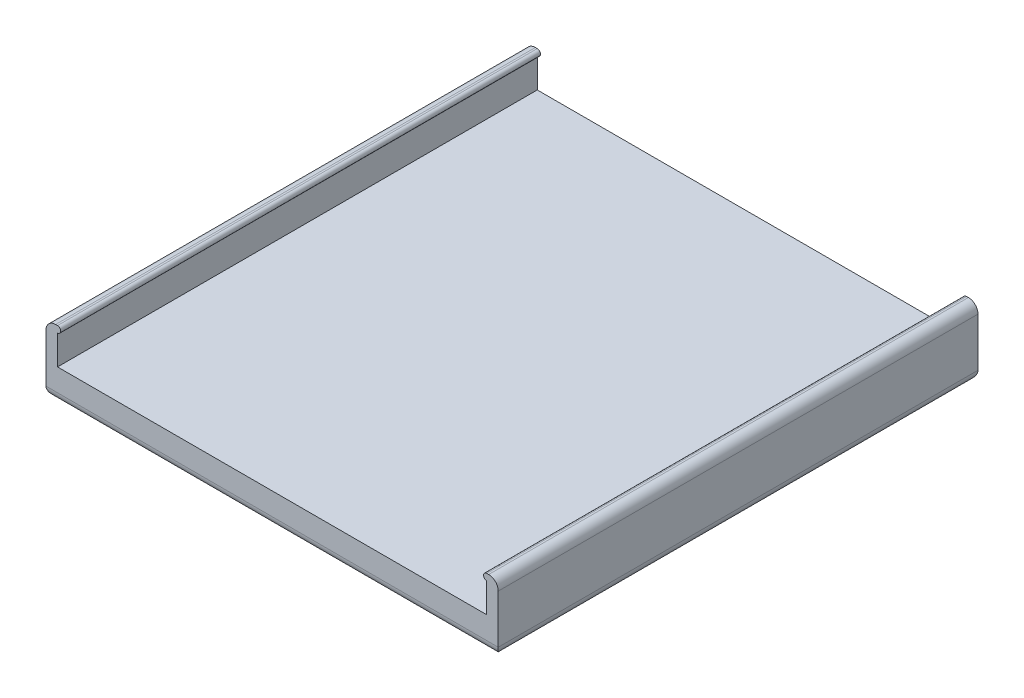
ISO-10303-21;
HEADER;
FILE_DESCRIPTION(('STEP AP214'),'2;1');
FILE_NAME('part.step','',(''),(''),'','','');
FILE_SCHEMA(('AUTOMOTIVE_DESIGN { 1 0 10303 214 1 1 1 1 }'));
ENDSEC;
DATA;
#1=APPLICATION_CONTEXT('core data for automotive mechanical design processes');
#2=APPLICATION_PROTOCOL_DEFINITION('international standard','automotive_design',2000,#1);
#3=PRODUCT_CONTEXT('',#1,'mechanical');
#4=PRODUCT('Part','Part','',(#3));
#5=PRODUCT_RELATED_PRODUCT_CATEGORY('part','',(#4));
#6=PRODUCT_DEFINITION_FORMATION('','',#4);
#7=PRODUCT_DEFINITION_CONTEXT('part definition',#1,'design');
#8=PRODUCT_DEFINITION('design','',#6,#7);
#9=PRODUCT_DEFINITION_SHAPE('','',#8);
#10=(LENGTH_UNIT() NAMED_UNIT(*) SI_UNIT(.MILLI.,.METRE.));
#11=(NAMED_UNIT(*) PLANE_ANGLE_UNIT() SI_UNIT($,.RADIAN.));
#12=(NAMED_UNIT(*) SI_UNIT($,.STERADIAN.) SOLID_ANGLE_UNIT());
#13=UNCERTAINTY_MEASURE_WITH_UNIT(LENGTH_MEASURE(1.E-05),#10,'distance_accuracy_value','');
#14=(GEOMETRIC_REPRESENTATION_CONTEXT(3) GLOBAL_UNCERTAINTY_ASSIGNED_CONTEXT((#13)) GLOBAL_UNIT_ASSIGNED_CONTEXT((#10,
#11,#12)) REPRESENTATION_CONTEXT('',''));
#15=CARTESIAN_POINT('',(0.,0.,0.));
#16=DIRECTION('',(0.,0.,1.));
#17=DIRECTION('',(1.,0.,0.));
#18=AXIS2_PLACEMENT_3D('',#15,#16,#17);
#19=CARTESIAN_POINT('',(36.25,5.,37.5));
#20=DIRECTION('',(0.,0.,-1.));
#21=DIRECTION('',(-1.,0.,0.));
#22=AXIS2_PLACEMENT_3D('',#19,#20,#21);
#23=PLANE('',#22);
#24=DIRECTION('',(0.,1.,0.));
#25=VECTOR('',#24,1.);
#26=CARTESIAN_POINT('',(35.35,10.6,37.5));
#27=LINE('',#26,#25);
#28=CARTESIAN_POINT('',(35.35,1.5,37.5));
#29=VERTEX_POINT('',#28);
#30=CARTESIAN_POINT('',(35.35,9.1,37.5));
#31=VERTEX_POINT('',#30);
#32=EDGE_CURVE('E557',#29,#31,#27,.T.);
#33=ORIENTED_EDGE('',*,*,#32,.T.);
#34=CARTESIAN_POINT('',(33.85,9.1,37.5));
#35=DIRECTION('',(0.,0.,-1.));
#36=DIRECTION('',(-1.,0.,0.));
#37=AXIS2_PLACEMENT_3D('',#34,#35,#36);
#38=CIRCLE('',#37,1.5);
#39=CARTESIAN_POINT('',(33.85,10.6,37.5));
#40=VERTEX_POINT('',#39);
#41=EDGE_CURVE('E252',#31,#40,#38,.F.);
#42=ORIENTED_EDGE('',*,*,#41,.T.);
#43=DIRECTION('',(1.,0.,0.));
#44=VECTOR('',#43,1.);
#45=CARTESIAN_POINT('',(36.25,10.6,37.5));
#46=LINE('',#45,#44);
#47=CARTESIAN_POINT('',(33.55,10.6,37.5));
#48=VERTEX_POINT('',#47);
#49=EDGE_CURVE('E178',#48,#40,#46,.T.);
#50=ORIENTED_EDGE('',*,*,#49,.F.);
#51=CARTESIAN_POINT('',(33.55,10.1,37.5));
#52=DIRECTION('',(0.,0.,1.));
#53=DIRECTION('',(1.,0.,0.));
#54=AXIS2_PLACEMENT_3D('',#51,#52,#53);
#55=CIRCLE('',#54,0.499999999999999);
#56=CARTESIAN_POINT('',(33.55,9.6,37.5));
#57=VERTEX_POINT('',#56);
#58=EDGE_CURVE('E564',#48,#57,#55,.T.);
#59=ORIENTED_EDGE('',*,*,#58,.T.);
#60=DIRECTION('',(0.,-1.,0.));
#61=VECTOR('',#60,1.);
#62=CARTESIAN_POINT('',(33.55,10.6,37.5));
#63=LINE('',#62,#61);
#64=CARTESIAN_POINT('',(33.55,5.,37.5));
#65=VERTEX_POINT('',#64);
#66=EDGE_CURVE('E176',#57,#65,#63,.T.);
#67=ORIENTED_EDGE('',*,*,#66,.T.);
#68=DIRECTION('',(1.,0.,0.));
#69=VECTOR('',#68,1.);
#70=CARTESIAN_POINT('',(36.25,5.,37.5));
#71=LINE('',#70,#69);
#72=CARTESIAN_POINT('',(-33.55,5.,37.5));
#73=VERTEX_POINT('',#72);
#74=EDGE_CURVE('E194',#73,#65,#71,.T.);
#75=ORIENTED_EDGE('',*,*,#74,.F.);
#76=DIRECTION('',(0.,-1.,0.));
#77=VECTOR('',#76,1.);
#78=CARTESIAN_POINT('',(-33.55,10.6,37.5));
#79=LINE('',#78,#77);
#80=CARTESIAN_POINT('',(-33.55,9.6,37.5));
#81=VERTEX_POINT('',#80);
#82=EDGE_CURVE('E166',#81,#73,#79,.T.);
#83=ORIENTED_EDGE('',*,*,#82,.F.);
#84=CARTESIAN_POINT('',(-33.55,10.1,37.5));
#85=DIRECTION('',(0.,0.,1.));
#86=DIRECTION('',(1.,0.,0.));
#87=AXIS2_PLACEMENT_3D('',#84,#85,#86);
#88=CIRCLE('',#87,0.499999999999999);
#89=CARTESIAN_POINT('',(-33.55,10.6,37.5));
#90=VERTEX_POINT('',#89);
#91=EDGE_CURVE('E147',#81,#90,#88,.T.);
#92=ORIENTED_EDGE('',*,*,#91,.T.);
#93=DIRECTION('',(1.,0.,0.));
#94=VECTOR('',#93,1.);
#95=CARTESIAN_POINT('',(-36.25,10.6,37.5));
#96=LINE('',#95,#94);
#97=CARTESIAN_POINT('',(-33.85,10.6,37.5));
#98=VERTEX_POINT('',#97);
#99=EDGE_CURVE('E572',#98,#90,#96,.T.);
#100=ORIENTED_EDGE('',*,*,#99,.F.);
#101=CARTESIAN_POINT('',(-33.85,9.1,37.5));
#102=DIRECTION('',(0.,0.,-1.));
#103=DIRECTION('',(-1.,0.,0.));
#104=AXIS2_PLACEMENT_3D('',#101,#102,#103);
#105=CIRCLE('',#104,1.5);
#106=CARTESIAN_POINT('',(-35.35,9.1,37.5));
#107=VERTEX_POINT('',#106);
#108=EDGE_CURVE('E61',#98,#107,#105,.F.);
#109=ORIENTED_EDGE('',*,*,#108,.T.);
#110=DIRECTION('',(0.,-1.,0.));
#111=VECTOR('',#110,1.);
#112=CARTESIAN_POINT('',(-35.35,0.,37.5));
#113=LINE('',#112,#111);
#114=CARTESIAN_POINT('',(-35.35,1.5,37.5));
#115=VERTEX_POINT('',#114);
#116=EDGE_CURVE('E242',#107,#115,#113,.T.);
#117=ORIENTED_EDGE('',*,*,#116,.T.);
#118=DIRECTION('',(1.,0.,0.));
#119=VECTOR('',#118,1.);
#120=CARTESIAN_POINT('',(36.25,1.5,37.5));
#121=LINE('',#120,#119);
#122=EDGE_CURVE('E223',#115,#29,#121,.T.);
#123=ORIENTED_EDGE('',*,*,#122,.T.);
#124=EDGE_LOOP('',(#33,#42,#50,#59,#67,#75,#83,#92,#100,#109,#117,#123));
#125=FACE_BOUND('',#124,.T.);
#126=ADVANCED_FACE('F39',(#125),#23,.F.);
#127=CARTESIAN_POINT('',(36.25,5.,-37.5));
#128=DIRECTION('',(0.,0.,1.));
#129=DIRECTION('',(1.,0.,0.));
#130=AXIS2_PLACEMENT_3D('',#127,#128,#129);
#131=PLANE('',#130);
#132=DIRECTION('',(-1.,0.,0.));
#133=VECTOR('',#132,1.);
#134=CARTESIAN_POINT('',(36.25,10.6,-37.5));
#135=LINE('',#134,#133);
#136=CARTESIAN_POINT('',(33.85,10.6,-37.5));
#137=VERTEX_POINT('',#136);
#138=CARTESIAN_POINT('',(33.55,10.6,-37.5));
#139=VERTEX_POINT('',#138);
#140=EDGE_CURVE('E182',#137,#139,#135,.T.);
#141=ORIENTED_EDGE('',*,*,#140,.F.);
#142=CARTESIAN_POINT('',(33.85,9.1,-37.5));
#143=DIRECTION('',(0.,0.,1.));
#144=DIRECTION('',(1.,0.,0.));
#145=AXIS2_PLACEMENT_3D('',#142,#143,#144);
#146=CIRCLE('',#145,1.5);
#147=CARTESIAN_POINT('',(35.35,9.1,-37.5));
#148=VERTEX_POINT('',#147);
#149=EDGE_CURVE('E247',#137,#148,#146,.F.);
#150=ORIENTED_EDGE('',*,*,#149,.T.);
#151=DIRECTION('',(0.,1.,0.));
#152=VECTOR('',#151,1.);
#153=CARTESIAN_POINT('',(35.35,10.6,-37.5));
#154=LINE('',#153,#152);
#155=CARTESIAN_POINT('',(35.35,1.5,-37.5));
#156=VERTEX_POINT('',#155);
#157=EDGE_CURVE('E555',#156,#148,#154,.T.);
#158=ORIENTED_EDGE('',*,*,#157,.F.);
#159=DIRECTION('',(-1.,0.,0.));
#160=VECTOR('',#159,1.);
#161=CARTESIAN_POINT('',(36.25,1.5,-37.5));
#162=LINE('',#161,#160);
#163=CARTESIAN_POINT('',(-35.35,1.5,-37.5));
#164=VERTEX_POINT('',#163);
#165=EDGE_CURVE('E211',#156,#164,#162,.T.);
#166=ORIENTED_EDGE('',*,*,#165,.T.);
#167=DIRECTION('',(0.,-1.,0.));
#168=VECTOR('',#167,1.);
#169=CARTESIAN_POINT('',(-35.35,0.,-37.5));
#170=LINE('',#169,#168);
#171=CARTESIAN_POINT('',(-35.35,9.1,-37.5));
#172=VERTEX_POINT('',#171);
#173=EDGE_CURVE('E553',#172,#164,#170,.T.);
#174=ORIENTED_EDGE('',*,*,#173,.F.);
#175=CARTESIAN_POINT('',(-33.85,9.1,-37.5));
#176=DIRECTION('',(0.,0.,1.));
#177=DIRECTION('',(1.,0.,0.));
#178=AXIS2_PLACEMENT_3D('',#175,#176,#177);
#179=CIRCLE('',#178,1.5);
#180=CARTESIAN_POINT('',(-33.85,10.6,-37.5));
#181=VERTEX_POINT('',#180);
#182=EDGE_CURVE('E245',#172,#181,#179,.F.);
#183=ORIENTED_EDGE('',*,*,#182,.T.);
#184=DIRECTION('',(-1.,0.,0.));
#185=VECTOR('',#184,1.);
#186=CARTESIAN_POINT('',(-36.25,10.6,-37.5));
#187=LINE('',#186,#185);
#188=CARTESIAN_POINT('',(-33.55,10.6,-37.5));
#189=VERTEX_POINT('',#188);
#190=EDGE_CURVE('E160',#189,#181,#187,.T.);
#191=ORIENTED_EDGE('',*,*,#190,.F.);
#192=CARTESIAN_POINT('',(-33.55,10.1,-37.5));
#193=DIRECTION('',(0.,0.,1.));
#194=DIRECTION('',(1.,0.,0.));
#195=AXIS2_PLACEMENT_3D('',#192,#193,#194);
#196=CIRCLE('',#195,0.499999999999999);
#197=CARTESIAN_POINT('',(-33.55,9.6,-37.5));
#198=VERTEX_POINT('',#197);
#199=EDGE_CURVE('E144',#189,#198,#196,.F.);
#200=ORIENTED_EDGE('',*,*,#199,.T.);
#201=DIRECTION('',(0.,-1.,0.));
#202=VECTOR('',#201,1.);
#203=CARTESIAN_POINT('',(-33.55,10.6,-37.5));
#204=LINE('',#203,#202);
#205=CARTESIAN_POINT('',(-33.55,5.,-37.5));
#206=VERTEX_POINT('',#205);
#207=EDGE_CURVE('E158',#198,#206,#204,.T.);
#208=ORIENTED_EDGE('',*,*,#207,.T.);
#209=DIRECTION('',(-1.,0.,0.));
#210=VECTOR('',#209,1.);
#211=CARTESIAN_POINT('',(36.25,5.,-37.5));
#212=LINE('',#211,#210);
#213=CARTESIAN_POINT('',(33.55,5.,-37.5));
#214=VERTEX_POINT('',#213);
#215=EDGE_CURVE('E197',#214,#206,#212,.T.);
#216=ORIENTED_EDGE('',*,*,#215,.F.);
#217=DIRECTION('',(0.,-1.,0.));
#218=VECTOR('',#217,1.);
#219=CARTESIAN_POINT('',(33.55,10.6,-37.5));
#220=LINE('',#219,#218);
#221=CARTESIAN_POINT('',(33.55,9.6,-37.5));
#222=VERTEX_POINT('',#221);
#223=EDGE_CURVE('E174',#222,#214,#220,.T.);
#224=ORIENTED_EDGE('',*,*,#223,.F.);
#225=CARTESIAN_POINT('',(33.55,10.1,-37.5));
#226=DIRECTION('',(0.,0.,1.));
#227=DIRECTION('',(1.,0.,0.));
#228=AXIS2_PLACEMENT_3D('',#225,#226,#227);
#229=CIRCLE('',#228,0.499999999999999);
#230=EDGE_CURVE('E559',#222,#139,#229,.F.);
#231=ORIENTED_EDGE('',*,*,#230,.T.);
#232=EDGE_LOOP('',(#141,#150,#158,#166,#174,#183,#191,#200,#208,#216,#224,#231));
#233=FACE_BOUND('',#232,.T.);
#234=ADVANCED_FACE('F156',(#233),#131,.F.);
#235=CARTESIAN_POINT('',(0.,5.,0.));
#236=DIRECTION('',(0.,1.,0.));
#237=DIRECTION('',(0.,0.,1.));
#238=AXIS2_PLACEMENT_3D('',#235,#236,#237);
#239=PLANE('',#238);
#240=DIRECTION('',(0.,0.,-1.));
#241=VECTOR('',#240,1.);
#242=CARTESIAN_POINT('',(-33.55,5.,37.5));
#243=LINE('',#242,#241);
#244=EDGE_CURVE('E165',#73,#206,#243,.T.);
#245=ORIENTED_EDGE('',*,*,#244,.F.);
#246=ORIENTED_EDGE('',*,*,#74,.T.);
#247=DIRECTION('',(0.,0.,1.));
#248=VECTOR('',#247,1.);
#249=CARTESIAN_POINT('',(33.55,5.,37.5));
#250=LINE('',#249,#248);
#251=EDGE_CURVE('E179',#214,#65,#250,.T.);
#252=ORIENTED_EDGE('',*,*,#251,.F.);
#253=ORIENTED_EDGE('',*,*,#215,.T.);
#254=EDGE_LOOP('',(#245,#246,#252,#253));
#255=FACE_BOUND('',#254,.T.);
#256=ADVANCED_FACE('F297',(#255),#239,.T.);
#257=CARTESIAN_POINT('',(0.,0.,0.));
#258=DIRECTION('',(0.,1.,0.));
#259=DIRECTION('',(0.,0.,1.));
#260=AXIS2_PLACEMENT_3D('',#257,#258,#259);
#261=PLANE('',#260);
#262=DIRECTION('',(1.,0.,0.));
#263=VECTOR('',#262,1.);
#264=CARTESIAN_POINT('',(0.,0.,36.));
#265=LINE('',#264,#263);
#266=CARTESIAN_POINT('',(33.85,0.,36.));
#267=VERTEX_POINT('',#266);
#268=CARTESIAN_POINT('',(-33.85,0.,36.));
#269=VERTEX_POINT('',#268);
#270=EDGE_CURVE('E216',#267,#269,#265,.F.);
#271=ORIENTED_EDGE('',*,*,#270,.T.);
#272=DIRECTION('',(0.,0.,-1.));
#273=VECTOR('',#272,1.);
#274=CARTESIAN_POINT('',(-33.85,0.,0.));
#275=LINE('',#274,#273);
#276=CARTESIAN_POINT('',(-33.85,0.,-36.));
#277=VERTEX_POINT('',#276);
#278=EDGE_CURVE('E221',#269,#277,#275,.T.);
#279=ORIENTED_EDGE('',*,*,#278,.T.);
#280=DIRECTION('',(-1.,0.,0.));
#281=VECTOR('',#280,1.);
#282=CARTESIAN_POINT('',(0.,0.,-36.));
#283=LINE('',#282,#281);
#284=CARTESIAN_POINT('',(33.85,0.,-36.));
#285=VERTEX_POINT('',#284);
#286=EDGE_CURVE('E218',#277,#285,#283,.F.);
#287=ORIENTED_EDGE('',*,*,#286,.T.);
#288=DIRECTION('',(0.,0.,-1.));
#289=VECTOR('',#288,1.);
#290=CARTESIAN_POINT('',(33.85,0.,0.));
#291=LINE('',#290,#289);
#292=EDGE_CURVE('E214',#285,#267,#291,.F.);
#293=ORIENTED_EDGE('',*,*,#292,.T.);
#294=EDGE_LOOP('',(#271,#279,#287,#293));
#295=FACE_BOUND('',#294,.T.);
#296=CARTESIAN_POINT('',(0.,0.,0.));
#297=DIRECTION('',(0.,1.,0.));
#298=DIRECTION('',(0.,0.,1.));
#299=AXIS2_PLACEMENT_3D('',#296,#297,#298);
#300=CIRCLE('',#299,29.1);
#301=CARTESIAN_POINT('',(0.,0.,29.1));
#302=VERTEX_POINT('',#301);
#303=EDGE_CURVE('E202',#302,#302,#300,.T.);
#304=ORIENTED_EDGE('',*,*,#303,.T.);
#305=EDGE_LOOP('',(#304));
#306=FACE_BOUND('',#305,.T.);
#307=ADVANCED_FACE('F301',(#295,#306),#261,.F.);
#308=CARTESIAN_POINT('',(0.,-5.,0.));
#309=DIRECTION('',(0.,-1.,0.));
#310=DIRECTION('',(0.,0.,-1.));
#311=AXIS2_PLACEMENT_3D('',#308,#309,#310);
#312=PLANE('',#311);
#313=CARTESIAN_POINT('',(0.,-5.,0.));
#314=DIRECTION('',(0.,-1.,0.));
#315=DIRECTION('',(0.,0.,-1.));
#316=AXIS2_PLACEMENT_3D('',#313,#314,#315);
#317=CIRCLE('',#316,26.1);
#318=CARTESIAN_POINT('',(0.,-5.,-26.1));
#319=VERTEX_POINT('',#318);
#320=EDGE_CURVE('E208',#319,#319,#317,.F.);
#321=ORIENTED_EDGE('',*,*,#320,.T.);
#322=EDGE_LOOP('',(#321));
#323=FACE_BOUND('',#322,.T.);
#324=CARTESIAN_POINT('',(0.,-5.,0.));
#325=DIRECTION('',(0.,-1.,0.));
#326=DIRECTION('',(0.,0.,-1.));
#327=AXIS2_PLACEMENT_3D('',#324,#325,#326);
#328=CIRCLE('',#327,27.1);
#329=CARTESIAN_POINT('',(0.,-5.,-27.1));
#330=VERTEX_POINT('',#329);
#331=EDGE_CURVE('E191',#330,#330,#328,.T.);
#332=ORIENTED_EDGE('',*,*,#331,.T.);
#333=EDGE_LOOP('',(#332));
#334=FACE_BOUND('',#333,.T.);
#335=ADVANCED_FACE('F303',(#323,#334),#312,.T.);
#336=CARTESIAN_POINT('',(0.,-5.,0.));
#337=DIRECTION('',(0.,1.,0.));
#338=DIRECTION('',(0.,0.,1.));
#339=AXIS2_PLACEMENT_3D('',#336,#337,#338);
#340=CYLINDRICAL_SURFACE('',#339,27.1);
#341=CARTESIAN_POINT('',(0.,-2.,0.));
#342=DIRECTION('',(0.,1.,0.));
#343=DIRECTION('',(0.,0.,1.));
#344=AXIS2_PLACEMENT_3D('',#341,#342,#343);
#345=CIRCLE('',#344,27.1);
#346=CARTESIAN_POINT('',(0.,-2.,27.1));
#347=VERTEX_POINT('',#346);
#348=EDGE_CURVE('E199',#347,#347,#345,.F.);
#349=ORIENTED_EDGE('',*,*,#348,.T.);
#350=EDGE_LOOP('',(#349));
#351=FACE_BOUND('',#350,.T.);
#352=ORIENTED_EDGE('',*,*,#331,.F.);
#353=EDGE_LOOP('',(#352));
#354=FACE_BOUND('',#353,.T.);
#355=ADVANCED_FACE('F266',(#351,#354),#340,.T.);
#356=CARTESIAN_POINT('',(0.,-5.,0.));
#357=DIRECTION('',(0.,1.,0.));
#358=DIRECTION('',(0.,0.,1.));
#359=AXIS2_PLACEMENT_3D('',#356,#357,#358);
#360=CYLINDRICAL_SURFACE('',#359,25.1);
#361=CARTESIAN_POINT('',(0.,-1.49749371855331,0.));
#362=DIRECTION('',(0.,1.,0.));
#363=DIRECTION('',(0.,0.,1.));
#364=AXIS2_PLACEMENT_3D('',#361,#362,#363);
#365=CIRCLE('',#364,25.1);
#366=CARTESIAN_POINT('',(0.,-1.49749371855331,25.1));
#367=VERTEX_POINT('',#366);
#368=EDGE_CURVE('E47',#367,#367,#365,.F.);
#369=ORIENTED_EDGE('',*,*,#368,.F.);
#370=EDGE_LOOP('',(#369));
#371=FACE_BOUND('',#370,.T.);
#372=CARTESIAN_POINT('',(0.,-4.,0.));
#373=DIRECTION('',(0.,-1.,0.));
#374=DIRECTION('',(0.,0.,-1.));
#375=AXIS2_PLACEMENT_3D('',#372,#373,#374);
#376=CIRCLE('',#375,25.1);
#377=CARTESIAN_POINT('',(0.,-4.,-25.1));
#378=VERTEX_POINT('',#377);
#379=EDGE_CURVE('E205',#378,#378,#376,.T.);
#380=ORIENTED_EDGE('',*,*,#379,.T.);
#381=EDGE_LOOP('',(#380));
#382=FACE_BOUND('',#381,.T.);
#383=ADVANCED_FACE('F262',(#371,#382),#360,.F.);
#384=CARTESIAN_POINT('',(33.55,10.6,37.5));
#385=DIRECTION('',(1.,0.,0.));
#386=DIRECTION('',(0.,0.,-1.));
#387=AXIS2_PLACEMENT_3D('',#384,#385,#386);
#388=PLANE('',#387);
#389=ORIENTED_EDGE('',*,*,#66,.F.);
#390=DIRECTION('',(0.,0.,1.));
#391=VECTOR('',#390,1.);
#392=CARTESIAN_POINT('',(33.55,9.6,-38.9142135623731));
#393=LINE('',#392,#391);
#394=EDGE_CURVE('E151',#57,#222,#393,.F.);
#395=ORIENTED_EDGE('',*,*,#394,.T.);
#396=ORIENTED_EDGE('',*,*,#223,.T.);
#397=ORIENTED_EDGE('',*,*,#251,.T.);
#398=EDGE_LOOP('',(#389,#395,#396,#397));
#399=FACE_BOUND('',#398,.T.);
#400=ADVANCED_FACE('F265',(#399),#388,.F.);
#401=CARTESIAN_POINT('',(0.,10.6,0.));
#402=DIRECTION('',(0.,1.,0.));
#403=DIRECTION('',(0.,0.,1.));
#404=AXIS2_PLACEMENT_3D('',#401,#402,#403);
#405=PLANE('',#404);
#406=ORIENTED_EDGE('',*,*,#49,.T.);
#407=DIRECTION('',(0.,0.,-1.));
#408=VECTOR('',#407,1.);
#409=CARTESIAN_POINT('',(33.85,10.6,-37.5));
#410=LINE('',#409,#408);
#411=EDGE_CURVE('E230',#40,#137,#410,.T.);
#412=ORIENTED_EDGE('',*,*,#411,.T.);
#413=ORIENTED_EDGE('',*,*,#140,.T.);
#414=DIRECTION('',(0.,0.,1.));
#415=VECTOR('',#414,1.);
#416=CARTESIAN_POINT('',(33.55,10.6,37.5));
#417=LINE('',#416,#415);
#418=EDGE_CURVE('E185',#139,#48,#417,.T.);
#419=ORIENTED_EDGE('',*,*,#418,.T.);
#420=EDGE_LOOP('',(#406,#412,#413,#419));
#421=FACE_BOUND('',#420,.T.);
#422=ADVANCED_FACE('F314',(#421),#405,.T.);
#423=CARTESIAN_POINT('',(-33.55,10.6,37.5));
#424=DIRECTION('',(-1.,0.,0.));
#425=DIRECTION('',(0.,0.,1.));
#426=AXIS2_PLACEMENT_3D('',#423,#424,#425);
#427=PLANE('',#426);
#428=ORIENTED_EDGE('',*,*,#207,.F.);
#429=DIRECTION('',(0.,0.,1.));
#430=VECTOR('',#429,1.);
#431=CARTESIAN_POINT('',(-33.55,9.6,-38.9142135623731));
#432=LINE('',#431,#430);
#433=EDGE_CURVE('E140',#198,#81,#432,.T.);
#434=ORIENTED_EDGE('',*,*,#433,.T.);
#435=ORIENTED_EDGE('',*,*,#82,.T.);
#436=ORIENTED_EDGE('',*,*,#244,.T.);
#437=EDGE_LOOP('',(#428,#434,#435,#436));
#438=FACE_BOUND('',#437,.T.);
#439=ADVANCED_FACE('F163',(#438),#427,.F.);
#440=CARTESIAN_POINT('',(0.,10.6,0.));
#441=DIRECTION('',(0.,-1.,0.));
#442=DIRECTION('',(0.,0.,-1.));
#443=AXIS2_PLACEMENT_3D('',#440,#441,#442);
#444=PLANE('',#443);
#445=ORIENTED_EDGE('',*,*,#190,.T.);
#446=DIRECTION('',(0.,0.,-1.));
#447=VECTOR('',#446,1.);
#448=CARTESIAN_POINT('',(-33.85,10.6,0.));
#449=LINE('',#448,#447);
#450=EDGE_CURVE('E54',#181,#98,#449,.F.);
#451=ORIENTED_EDGE('',*,*,#450,.T.);
#452=ORIENTED_EDGE('',*,*,#99,.T.);
#453=DIRECTION('',(0.,0.,-1.));
#454=VECTOR('',#453,1.);
#455=CARTESIAN_POINT('',(-33.55,10.6,37.5));
#456=LINE('',#455,#454);
#457=EDGE_CURVE('E170',#90,#189,#456,.T.);
#458=ORIENTED_EDGE('',*,*,#457,.T.);
#459=EDGE_LOOP('',(#445,#451,#452,#458));
#460=FACE_BOUND('',#459,.T.);
#461=ADVANCED_FACE('F323',(#460),#444,.F.);
#462=CARTESIAN_POINT('',(-33.55,10.1,-38.9142135623731));
#463=DIRECTION('',(0.,0.,1.));
#464=DIRECTION('',(1.,0.,0.));
#465=AXIS2_PLACEMENT_3D('',#462,#463,#464);
#466=CYLINDRICAL_SURFACE('',#465,0.499999999999999);
#467=ORIENTED_EDGE('',*,*,#433,.F.);
#468=ORIENTED_EDGE('',*,*,#199,.F.);
#469=ORIENTED_EDGE('',*,*,#457,.F.);
#470=ORIENTED_EDGE('',*,*,#91,.F.);
#471=EDGE_LOOP('',(#467,#468,#469,#470));
#472=FACE_BOUND('',#471,.T.);
#473=ADVANCED_FACE('F142',(#472),#466,.T.);
#474=CARTESIAN_POINT('',(33.55,10.1,-38.9142135623731));
#475=DIRECTION('',(0.,0.,1.));
#476=DIRECTION('',(1.,0.,0.));
#477=AXIS2_PLACEMENT_3D('',#474,#475,#476);
#478=CYLINDRICAL_SURFACE('',#477,0.499999999999999);
#479=ORIENTED_EDGE('',*,*,#394,.F.);
#480=ORIENTED_EDGE('',*,*,#58,.F.);
#481=ORIENTED_EDGE('',*,*,#418,.F.);
#482=ORIENTED_EDGE('',*,*,#230,.F.);
#483=EDGE_LOOP('',(#479,#480,#481,#482));
#484=FACE_BOUND('',#483,.T.);
#485=ADVANCED_FACE('F326',(#484),#478,.T.);
#486=CARTESIAN_POINT('',(-35.35,0.,37.5));
#487=DIRECTION('',(1.,0.,0.));
#488=DIRECTION('',(0.,0.,-1.));
#489=AXIS2_PLACEMENT_3D('',#486,#487,#488);
#490=PLANE('',#489);
#491=ORIENTED_EDGE('',*,*,#116,.F.);
#492=DIRECTION('',(0.,0.,-1.));
#493=VECTOR('',#492,1.);
#494=CARTESIAN_POINT('',(-35.35,9.1,37.5));
#495=LINE('',#494,#493);
#496=EDGE_CURVE('E254',#107,#172,#495,.T.);
#497=ORIENTED_EDGE('',*,*,#496,.T.);
#498=ORIENTED_EDGE('',*,*,#173,.T.);
#499=DIRECTION('',(0.,0.,-1.));
#500=VECTOR('',#499,1.);
#501=CARTESIAN_POINT('',(-35.35,1.5,37.5));
#502=LINE('',#501,#500);
#503=EDGE_CURVE('E225',#164,#115,#502,.F.);
#504=ORIENTED_EDGE('',*,*,#503,.T.);
#505=EDGE_LOOP('',(#491,#497,#498,#504));
#506=FACE_BOUND('',#505,.T.);
#507=ADVANCED_FACE('F329',(#506),#490,.F.);
#508=CARTESIAN_POINT('',(35.35,10.6,37.5));
#509=DIRECTION('',(-1.,0.,0.));
#510=DIRECTION('',(0.,0.,1.));
#511=AXIS2_PLACEMENT_3D('',#508,#509,#510);
#512=PLANE('',#511);
#513=ORIENTED_EDGE('',*,*,#157,.T.);
#514=DIRECTION('',(0.,0.,-1.));
#515=VECTOR('',#514,1.);
#516=CARTESIAN_POINT('',(35.35,9.1,37.5));
#517=LINE('',#516,#515);
#518=EDGE_CURVE('E249',#148,#31,#517,.F.);
#519=ORIENTED_EDGE('',*,*,#518,.T.);
#520=ORIENTED_EDGE('',*,*,#32,.F.);
#521=DIRECTION('',(0.,0.,-1.));
#522=VECTOR('',#521,1.);
#523=CARTESIAN_POINT('',(35.35,1.5,37.5));
#524=LINE('',#523,#522);
#525=EDGE_CURVE('E228',#29,#156,#524,.T.);
#526=ORIENTED_EDGE('',*,*,#525,.T.);
#527=EDGE_LOOP('',(#513,#519,#520,#526));
#528=FACE_BOUND('',#527,.T.);
#529=ADVANCED_FACE('F286',(#528),#512,.F.);
#530=CARTESIAN_POINT('',(0.,-2.,0.));
#531=DIRECTION('',(0.,1.,0.));
#532=DIRECTION('',(0.,0.,1.));
#533=AXIS2_PLACEMENT_3D('',#530,#531,#532);
#534=TOROIDAL_SURFACE('',#533,29.1,2.);
#535=ORIENTED_EDGE('',*,*,#303,.F.);
#536=EDGE_LOOP('',(#535));
#537=FACE_BOUND('',#536,.T.);
#538=ORIENTED_EDGE('',*,*,#348,.F.);
#539=EDGE_LOOP('',(#538));
#540=FACE_BOUND('',#539,.T.);
#541=ADVANCED_FACE('F274',(#537,#540),#534,.F.);
#542=CARTESIAN_POINT('',(0.,-4.,0.));
#543=DIRECTION('',(0.,-1.,0.));
#544=DIRECTION('',(0.,0.,-1.));
#545=AXIS2_PLACEMENT_3D('',#542,#543,#544);
#546=TOROIDAL_SURFACE('',#545,26.1,1.);
#547=ORIENTED_EDGE('',*,*,#320,.F.);
#548=EDGE_LOOP('',(#547));
#549=FACE_BOUND('',#548,.T.);
#550=ORIENTED_EDGE('',*,*,#379,.F.);
#551=EDGE_LOOP('',(#550));
#552=FACE_BOUND('',#551,.T.);
#553=ADVANCED_FACE('F271',(#549,#552),#546,.T.);
#554=CARTESIAN_POINT('',(36.25,1.5,36.));
#555=DIRECTION('',(1.,0.,0.));
#556=DIRECTION('',(0.,0.,-1.));
#557=AXIS2_PLACEMENT_3D('',#554,#555,#556);
#558=CYLINDRICAL_SURFACE('',#557,1.5);
#559=CARTESIAN_POINT('',(-33.85,1.5,36.));
#560=DIRECTION('',(-0.707106781186548,0.,-0.707106781186547));
#561=DIRECTION('',(0.707106781186547,0.,-0.707106781186547));
#562=AXIS2_PLACEMENT_3D('',#559,#560,#561);
#563=ELLIPSE('',#562,2.12132034355964,1.5);
#564=EDGE_CURVE('E236',#269,#115,#563,.T.);
#565=ORIENTED_EDGE('',*,*,#564,.F.);
#566=ORIENTED_EDGE('',*,*,#270,.F.);
#567=CARTESIAN_POINT('',(33.85,1.5,36.));
#568=DIRECTION('',(0.707106781186547,0.,-0.707106781186547));
#569=DIRECTION('',(-0.707106781186548,0.,-0.707106781186547));
#570=AXIS2_PLACEMENT_3D('',#567,#568,#569);
#571=ELLIPSE('',#570,2.12132034355964,1.5);
#572=EDGE_CURVE('E239',#29,#267,#571,.T.);
#573=ORIENTED_EDGE('',*,*,#572,.F.);
#574=ORIENTED_EDGE('',*,*,#122,.F.);
#575=EDGE_LOOP('',(#565,#566,#573,#574));
#576=FACE_BOUND('',#575,.T.);
#577=ADVANCED_FACE('F273',(#576),#558,.T.);
#578=CARTESIAN_POINT('',(33.85,1.5,37.5));
#579=DIRECTION('',(0.,0.,-1.));
#580=DIRECTION('',(-1.,0.,0.));
#581=AXIS2_PLACEMENT_3D('',#578,#579,#580);
#582=CYLINDRICAL_SURFACE('',#581,1.5);
#583=ORIENTED_EDGE('',*,*,#572,.T.);
#584=ORIENTED_EDGE('',*,*,#292,.F.);
#585=CARTESIAN_POINT('',(33.85,1.5,-36.));
#586=DIRECTION('',(-0.707106781186547,0.,-0.707106781186547));
#587=DIRECTION('',(0.707106781186547,0.,-0.707106781186547));
#588=AXIS2_PLACEMENT_3D('',#585,#586,#587);
#589=ELLIPSE('',#588,2.12132034355964,1.5);
#590=EDGE_CURVE('E234',#156,#285,#589,.T.);
#591=ORIENTED_EDGE('',*,*,#590,.F.);
#592=ORIENTED_EDGE('',*,*,#525,.F.);
#593=EDGE_LOOP('',(#583,#584,#591,#592));
#594=FACE_BOUND('',#593,.T.);
#595=ADVANCED_FACE('F282',(#594),#582,.T.);
#596=CARTESIAN_POINT('',(-33.85,1.5,0.));
#597=DIRECTION('',(0.,0.,-1.));
#598=DIRECTION('',(-1.,0.,0.));
#599=AXIS2_PLACEMENT_3D('',#596,#597,#598);
#600=CYLINDRICAL_SURFACE('',#599,1.5);
#601=ORIENTED_EDGE('',*,*,#564,.T.);
#602=ORIENTED_EDGE('',*,*,#503,.F.);
#603=CARTESIAN_POINT('',(-33.85,1.5,-36.));
#604=DIRECTION('',(0.707106781186547,0.,-0.707106781186547));
#605=DIRECTION('',(-0.707106781186547,0.,-0.707106781186547));
#606=AXIS2_PLACEMENT_3D('',#603,#604,#605);
#607=ELLIPSE('',#606,2.12132034355964,1.5);
#608=EDGE_CURVE('E231',#277,#164,#607,.T.);
#609=ORIENTED_EDGE('',*,*,#608,.F.);
#610=ORIENTED_EDGE('',*,*,#278,.F.);
#611=EDGE_LOOP('',(#601,#602,#609,#610));
#612=FACE_BOUND('',#611,.T.);
#613=ADVANCED_FACE('F380',(#612),#600,.T.);
#614=CARTESIAN_POINT('',(36.25,1.5,-36.));
#615=DIRECTION('',(-1.,0.,0.));
#616=DIRECTION('',(0.,0.,1.));
#617=AXIS2_PLACEMENT_3D('',#614,#615,#616);
#618=CYLINDRICAL_SURFACE('',#617,1.5);
#619=ORIENTED_EDGE('',*,*,#590,.T.);
#620=ORIENTED_EDGE('',*,*,#286,.F.);
#621=ORIENTED_EDGE('',*,*,#608,.T.);
#622=ORIENTED_EDGE('',*,*,#165,.F.);
#623=EDGE_LOOP('',(#619,#620,#621,#622));
#624=FACE_BOUND('',#623,.T.);
#625=ADVANCED_FACE('F373',(#624),#618,.T.);
#626=CARTESIAN_POINT('',(33.85,9.1,0.));
#627=DIRECTION('',(0.,0.,1.));
#628=DIRECTION('',(1.,0.,0.));
#629=AXIS2_PLACEMENT_3D('',#626,#627,#628);
#630=CYLINDRICAL_SURFACE('',#629,1.5);
#631=ORIENTED_EDGE('',*,*,#41,.F.);
#632=ORIENTED_EDGE('',*,*,#518,.F.);
#633=ORIENTED_EDGE('',*,*,#149,.F.);
#634=ORIENTED_EDGE('',*,*,#411,.F.);
#635=EDGE_LOOP('',(#631,#632,#633,#634));
#636=FACE_BOUND('',#635,.T.);
#637=ADVANCED_FACE('F347',(#636),#630,.T.);
#638=CARTESIAN_POINT('',(-33.85,9.1,37.5));
#639=DIRECTION('',(0.,0.,-1.));
#640=DIRECTION('',(-1.,0.,0.));
#641=AXIS2_PLACEMENT_3D('',#638,#639,#640);
#642=CYLINDRICAL_SURFACE('',#641,1.5);
#643=ORIENTED_EDGE('',*,*,#108,.F.);
#644=ORIENTED_EDGE('',*,*,#450,.F.);
#645=ORIENTED_EDGE('',*,*,#182,.F.);
#646=ORIENTED_EDGE('',*,*,#496,.F.);
#647=EDGE_LOOP('',(#643,#644,#645,#646));
#648=FACE_BOUND('',#647,.T.);
#649=ADVANCED_FACE('F41',(#648),#642,.T.);
#650=CARTESIAN_POINT('',(0.,-1.,0.));
#651=DIRECTION('',(0.,1.,0.));
#652=DIRECTION('',(0.,0.,1.));
#653=AXIS2_PLACEMENT_3D('',#650,#651,#652);
#654=TOROIDAL_SURFACE('',#653,25.05,0.499999999999999);
#655=CARTESIAN_POINT('',(0.,-0.502506281446691,0.));
#656=DIRECTION('',(0.,-1.,0.));
#657=DIRECTION('',(0.,0.,-1.));
#658=AXIS2_PLACEMENT_3D('',#655,#656,#657);
#659=CIRCLE('',#658,25.1);
#660=CARTESIAN_POINT('',(0.,-0.502506281446688,-25.1));
#661=VERTEX_POINT('',#660);
#662=EDGE_CURVE('E11',#661,#661,#659,.F.);
#663=ORIENTED_EDGE('',*,*,#662,.T.);
#664=EDGE_LOOP('',(#663));
#665=FACE_BOUND('',#664,.T.);
#666=ORIENTED_EDGE('',*,*,#368,.T.);
#667=EDGE_LOOP('',(#666));
#668=FACE_BOUND('',#667,.T.);
#669=ADVANCED_FACE('F260',(#665,#668),#654,.T.);
#670=CARTESIAN_POINT('',(0.,0.,0.));
#671=DIRECTION('',(0.,-1.,0.));
#672=DIRECTION('',(0.,0.,-1.));
#673=AXIS2_PLACEMENT_3D('',#670,#671,#672);
#674=CIRCLE('',#673,25.1);
#675=CARTESIAN_POINT('',(0.,0.,-25.1));
#676=VERTEX_POINT('',#675);
#677=EDGE_CURVE('E168',#676,#676,#674,.T.);
#678=ORIENTED_EDGE('',*,*,#677,.T.);
#679=EDGE_LOOP('',(#678));
#680=FACE_BOUND('',#679,.T.);
#681=ADVANCED_FACE('F305',(#680),#261,.F.);
#682=ORIENTED_EDGE('',*,*,#662,.F.);
#683=EDGE_LOOP('',(#682));
#684=FACE_BOUND('',#683,.T.);
#685=ORIENTED_EDGE('',*,*,#677,.F.);
#686=EDGE_LOOP('',(#685));
#687=FACE_BOUND('',#686,.T.);
#688=ADVANCED_FACE('F268',(#684,#687),#360,.F.);
#689=CLOSED_SHELL('',(#126,#234,#256,#307,#335,#355,#383,#400,#422,#439,#461,#473,#485,#507,
#529,#541,#553,#577,#595,#613,#625,#637,#649,#669,#681,#688));
#690=MANIFOLD_SOLID_BREP('B2',#689);
#691=ADVANCED_BREP_SHAPE_REPRESENTATION('',(#18,#690),#14);
#692=SHAPE_DEFINITION_REPRESENTATION(#9,#691);
ENDSEC;
END-ISO-10303-21;
